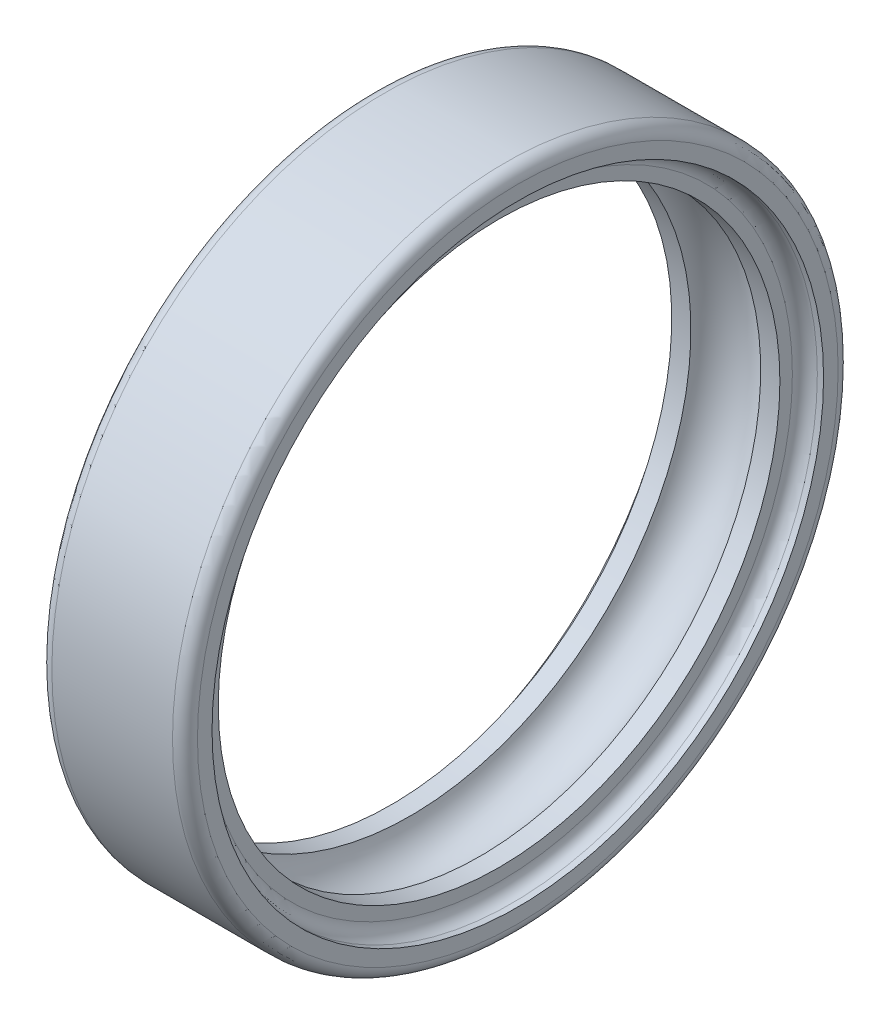
ISO-10303-21;
HEADER;
FILE_DESCRIPTION(('STEP AP214'),'2;1');
FILE_NAME('part.step','',(''),(''),'','','');
FILE_SCHEMA(('AUTOMOTIVE_DESIGN { 1 0 10303 214 1 1 1 1 }'));
ENDSEC;
DATA;
#1=APPLICATION_CONTEXT('core data for automotive mechanical design processes');
#2=APPLICATION_PROTOCOL_DEFINITION('international standard','automotive_design',2000,#1);
#3=PRODUCT_CONTEXT('',#1,'mechanical');
#4=PRODUCT('Part','Part','',(#3));
#5=PRODUCT_RELATED_PRODUCT_CATEGORY('part','',(#4));
#6=PRODUCT_DEFINITION_FORMATION('','',#4);
#7=PRODUCT_DEFINITION_CONTEXT('part definition',#1,'design');
#8=PRODUCT_DEFINITION('design','',#6,#7);
#9=PRODUCT_DEFINITION_SHAPE('','',#8);
#10=(LENGTH_UNIT() NAMED_UNIT(*) SI_UNIT(.MILLI.,.METRE.));
#11=(NAMED_UNIT(*) PLANE_ANGLE_UNIT() SI_UNIT($,.RADIAN.));
#12=(NAMED_UNIT(*) SI_UNIT($,.STERADIAN.) SOLID_ANGLE_UNIT());
#13=UNCERTAINTY_MEASURE_WITH_UNIT(LENGTH_MEASURE(1.E-05),#10,'distance_accuracy_value','');
#14=(GEOMETRIC_REPRESENTATION_CONTEXT(3) GLOBAL_UNCERTAINTY_ASSIGNED_CONTEXT((#13)) GLOBAL_UNIT_ASSIGNED_CONTEXT((#10,
#11,#12)) REPRESENTATION_CONTEXT('',''));
#15=CARTESIAN_POINT('',(0.,0.,0.));
#16=DIRECTION('',(0.,0.,1.));
#17=DIRECTION('',(1.,0.,0.));
#18=AXIS2_PLACEMENT_3D('',#15,#16,#17);
#19=CARTESIAN_POINT('',(0.,-15.6860756936389,-15.4));
#20=DIRECTION('',(-1.,0.,0.));
#21=DIRECTION('',(0.,0.,1.));
#22=AXIS2_PLACEMENT_3D('',#19,#20,#21);
#23=PLANE('',#22);
#24=CARTESIAN_POINT('',(0.,0.,0.));
#25=DIRECTION('',(-1.,0.,0.));
#26=DIRECTION('',(0.,0.,-1.));
#27=AXIS2_PLACEMENT_3D('',#24,#25,#26);
#28=CIRCLE('',#27,15.4000000346272);
#29=CARTESIAN_POINT('',(0.,0.,-15.4000000346272));
#30=VERTEX_POINT('',#29);
#31=EDGE_CURVE('E64',#30,#30,#28,.F.);
#32=ORIENTED_EDGE('',*,*,#31,.F.);
#33=EDGE_LOOP('',(#32));
#34=FACE_BOUND('',#33,.T.);
#35=CARTESIAN_POINT('',(0.,0.,0.));
#36=DIRECTION('',(1.,0.,0.));
#37=DIRECTION('',(0.,-1.16855713314385E-09,1.));
#38=AXIS2_PLACEMENT_3D('',#35,#36,#37);
#39=CIRCLE('',#38,14.7);
#40=CARTESIAN_POINT('',(0.,-1.71777898572145E-08,14.7));
#41=VERTEX_POINT('',#40);
#42=EDGE_CURVE('E61',#41,#41,#39,.T.);
#43=ORIENTED_EDGE('',*,*,#42,.T.);
#44=EDGE_LOOP('',(#43));
#45=FACE_BOUND('',#44,.T.);
#46=ADVANCED_FACE('F17',(#34,#45),#23,.T.);
#47=CARTESIAN_POINT('',(0.9,-14.361926438475,-14.1));
#48=DIRECTION('',(-1.,0.,0.));
#49=DIRECTION('',(0.,0.,1.));
#50=AXIS2_PLACEMENT_3D('',#47,#48,#49);
#51=PLANE('',#50);
#52=CARTESIAN_POINT('',(0.9,0.,0.));
#53=DIRECTION('',(-1.,0.,0.));
#54=DIRECTION('',(0.,0.,-1.));
#55=AXIS2_PLACEMENT_3D('',#52,#53,#54);
#56=CIRCLE('',#55,14.1000000419357);
#57=CARTESIAN_POINT('',(0.9,0.,-14.1000000419357));
#58=VERTEX_POINT('',#57);
#59=EDGE_CURVE('E58',#58,#58,#56,.F.);
#60=ORIENTED_EDGE('',*,*,#59,.F.);
#61=EDGE_LOOP('',(#60));
#62=FACE_BOUND('',#61,.T.);
#63=CARTESIAN_POINT('',(0.9,0.,0.));
#64=DIRECTION('',(1.,0.,0.));
#65=DIRECTION('',(0.,0.,1.));
#66=AXIS2_PLACEMENT_3D('',#63,#64,#65);
#67=CIRCLE('',#66,13.5);
#68=CARTESIAN_POINT('',(0.9,0.,13.5));
#69=VERTEX_POINT('',#68);
#70=EDGE_CURVE('E55',#69,#69,#67,.T.);
#71=ORIENTED_EDGE('',*,*,#70,.T.);
#72=EDGE_LOOP('',(#71));
#73=FACE_BOUND('',#72,.T.);
#74=ADVANCED_FACE('F73',(#62,#73),#51,.T.);
#75=CARTESIAN_POINT('',(6.1,-14.3619264222441,14.1));
#76=DIRECTION('',(1.,0.,0.));
#77=DIRECTION('',(0.,0.,-1.));
#78=AXIS2_PLACEMENT_3D('',#75,#76,#77);
#79=PLANE('',#78);
#80=CARTESIAN_POINT('',(6.1,0.,0.));
#81=DIRECTION('',(1.,0.,0.));
#82=DIRECTION('',(0.,-1.16841660066666E-09,1.));
#83=AXIS2_PLACEMENT_3D('',#80,#81,#82);
#84=CIRCLE('',#83,14.1);
#85=CARTESIAN_POINT('',(6.1,-1.64746740694E-08,14.1));
#86=VERTEX_POINT('',#85);
#87=EDGE_CURVE('E52',#86,#86,#84,.T.);
#88=ORIENTED_EDGE('',*,*,#87,.T.);
#89=EDGE_LOOP('',(#88));
#90=FACE_BOUND('',#89,.T.);
#91=CARTESIAN_POINT('',(6.1,0.,0.));
#92=DIRECTION('',(-1.,0.,0.));
#93=DIRECTION('',(0.,0.,-1.));
#94=AXIS2_PLACEMENT_3D('',#91,#92,#93);
#95=CIRCLE('',#94,13.5);
#96=CARTESIAN_POINT('',(6.1,0.,-13.5));
#97=VERTEX_POINT('',#96);
#98=EDGE_CURVE('E49',#97,#97,#95,.F.);
#99=ORIENTED_EDGE('',*,*,#98,.F.);
#100=EDGE_LOOP('',(#99));
#101=FACE_BOUND('',#100,.T.);
#102=ADVANCED_FACE('F123',(#90,#101),#79,.T.);
#103=CARTESIAN_POINT('',(7.,-15.6860756936389,15.4));
#104=DIRECTION('',(1.,0.,0.));
#105=DIRECTION('',(0.,0.,-1.));
#106=AXIS2_PLACEMENT_3D('',#103,#104,#105);
#107=PLANE('',#106);
#108=CARTESIAN_POINT('',(7.,0.,0.));
#109=DIRECTION('',(1.,0.,0.));
#110=DIRECTION('',(0.,0.,1.));
#111=AXIS2_PLACEMENT_3D('',#108,#109,#110);
#112=CIRCLE('',#111,15.4000000720822);
#113=CARTESIAN_POINT('',(7.,0.,15.4000000720822));
#114=VERTEX_POINT('',#113);
#115=EDGE_CURVE('E46',#114,#114,#112,.T.);
#116=ORIENTED_EDGE('',*,*,#115,.T.);
#117=EDGE_LOOP('',(#116));
#118=FACE_BOUND('',#117,.T.);
#119=CARTESIAN_POINT('',(7.,0.,0.));
#120=DIRECTION('',(-1.,0.,0.));
#121=DIRECTION('',(0.,0.,-1.));
#122=AXIS2_PLACEMENT_3D('',#119,#120,#121);
#123=CIRCLE('',#122,14.7);
#124=CARTESIAN_POINT('',(7.,0.,-14.7));
#125=VERTEX_POINT('',#124);
#126=EDGE_CURVE('E43',#125,#125,#123,.F.);
#127=ORIENTED_EDGE('',*,*,#126,.F.);
#128=EDGE_LOOP('',(#127));
#129=FACE_BOUND('',#128,.T.);
#130=ADVANCED_FACE('F90',(#118,#129),#107,.T.);
#131=CARTESIAN_POINT('',(0.599999999999872,0.,0.));
#132=DIRECTION('',(1.,0.,0.));
#133=DIRECTION('',(0.,1.92328942001804E-10,1.));
#134=AXIS2_PLACEMENT_3D('',#131,#132,#133);
#135=TOROIDAL_SURFACE('',#134,15.4,0.599999999999873);
#136=ORIENTED_EDGE('',*,*,#31,.T.);
#137=EDGE_LOOP('',(#136));
#138=FACE_BOUND('',#137,.T.);
#139=CARTESIAN_POINT('',(0.599999999999872,0.,0.));
#140=DIRECTION('',(-1.,0.,0.));
#141=DIRECTION('',(0.,0.,-1.));
#142=AXIS2_PLACEMENT_3D('',#139,#140,#141);
#143=CIRCLE('',#142,15.9999999999999);
#144=CARTESIAN_POINT('',(0.599999999999872,0.,-15.9999999999999));
#145=VERTEX_POINT('',#144);
#146=EDGE_CURVE('E40',#145,#145,#143,.F.);
#147=ORIENTED_EDGE('',*,*,#146,.F.);
#148=EDGE_LOOP('',(#147));
#149=FACE_BOUND('',#148,.T.);
#150=ADVANCED_FACE('F68',(#138,#149),#135,.T.);
#151=CARTESIAN_POINT('',(50.,0.,0.));
#152=DIRECTION('',(1.,0.,0.));
#153=DIRECTION('',(0.,0.,1.));
#154=AXIS2_PLACEMENT_3D('',#151,#152,#153);
#155=CYLINDRICAL_SURFACE('',#154,14.7);
#156=CARTESIAN_POINT('',(0.299999999999997,0.,0.));
#157=DIRECTION('',(1.,0.,0.));
#158=DIRECTION('',(0.,0.,1.));
#159=AXIS2_PLACEMENT_3D('',#156,#157,#158);
#160=CIRCLE('',#159,14.7);
#161=CARTESIAN_POINT('',(0.299999999999997,0.,14.7));
#162=VERTEX_POINT('',#161);
#163=EDGE_CURVE('E37',#162,#162,#160,.T.);
#164=ORIENTED_EDGE('',*,*,#163,.T.);
#165=EDGE_LOOP('',(#164));
#166=FACE_BOUND('',#165,.T.);
#167=ORIENTED_EDGE('',*,*,#42,.F.);
#168=EDGE_LOOP('',(#167));
#169=FACE_BOUND('',#168,.T.);
#170=ADVANCED_FACE('F77',(#166,#169),#155,.F.);
#171=CARTESIAN_POINT('',(0.300000000000125,0.,0.));
#172=DIRECTION('',(1.,0.,0.));
#173=DIRECTION('',(0.,1.16841659714859E-09,1.));
#174=AXIS2_PLACEMENT_3D('',#171,#172,#173);
#175=TOROIDAL_SURFACE('',#174,14.1000000000001,0.599999999999877);
#176=ORIENTED_EDGE('',*,*,#59,.T.);
#177=EDGE_LOOP('',(#176));
#178=FACE_BOUND('',#177,.T.);
#179=ORIENTED_EDGE('',*,*,#163,.F.);
#180=EDGE_LOOP('',(#179));
#181=FACE_BOUND('',#180,.T.);
#182=ADVANCED_FACE('F79',(#178,#181),#175,.F.);
#183=CARTESIAN_POINT('',(50.,0.,0.));
#184=DIRECTION('',(1.,0.,0.));
#185=DIRECTION('',(0.,0.,1.));
#186=AXIS2_PLACEMENT_3D('',#183,#184,#185);
#187=CYLINDRICAL_SURFACE('',#186,13.5);
#188=CARTESIAN_POINT('',(1.8229490168752,0.,0.));
#189=DIRECTION('',(1.,0.,0.));
#190=DIRECTION('',(0.,0.,1.));
#191=AXIS2_PLACEMENT_3D('',#188,#189,#190);
#192=CIRCLE('',#191,13.5);
#193=CARTESIAN_POINT('',(1.8229490168752,0.,13.5));
#194=VERTEX_POINT('',#193);
#195=EDGE_CURVE('E32',#194,#194,#192,.T.);
#196=ORIENTED_EDGE('',*,*,#195,.T.);
#197=EDGE_LOOP('',(#196));
#198=FACE_BOUND('',#197,.T.);
#199=ORIENTED_EDGE('',*,*,#70,.F.);
#200=EDGE_LOOP('',(#199));
#201=FACE_BOUND('',#200,.T.);
#202=ADVANCED_FACE('F87',(#198,#201),#187,.F.);
#203=CARTESIAN_POINT('',(3.5,0.,0.));
#204=DIRECTION('',(1.,0.,0.));
#205=DIRECTION('',(0.,7.69327835111053E-10,1.));
#206=AXIS2_PLACEMENT_3D('',#203,#204,#205);
#207=TOROIDAL_SURFACE('',#206,13.,1.74999999999994);
#208=ORIENTED_EDGE('',*,*,#195,.F.);
#209=EDGE_LOOP('',(#208));
#210=FACE_BOUND('',#209,.T.);
#211=CARTESIAN_POINT('',(5.17705098312478,0.,0.));
#212=DIRECTION('',(1.,0.,0.));
#213=DIRECTION('',(0.,-1.92332249786123E-10,1.));
#214=AXIS2_PLACEMENT_3D('',#211,#212,#213);
#215=CIRCLE('',#214,13.5);
#216=CARTESIAN_POINT('',(5.17705098312478,-2.59648537211266E-09,13.5));
#217=VERTEX_POINT('',#216);
#218=EDGE_CURVE('E28',#217,#217,#215,.T.);
#219=ORIENTED_EDGE('',*,*,#218,.T.);
#220=EDGE_LOOP('',(#219));
#221=FACE_BOUND('',#220,.T.);
#222=ADVANCED_FACE('F96',(#210,#221),#207,.F.);
#223=CARTESIAN_POINT('',(50.,0.,0.));
#224=DIRECTION('',(1.,0.,0.));
#225=DIRECTION('',(0.,0.,1.));
#226=AXIS2_PLACEMENT_3D('',#223,#224,#225);
#227=CYLINDRICAL_SURFACE('',#226,13.5);
#228=ORIENTED_EDGE('',*,*,#98,.T.);
#229=EDGE_LOOP('',(#228));
#230=FACE_BOUND('',#229,.T.);
#231=ORIENTED_EDGE('',*,*,#218,.F.);
#232=EDGE_LOOP('',(#231));
#233=FACE_BOUND('',#232,.T.);
#234=ADVANCED_FACE('F100',(#230,#233),#227,.F.);
#235=CARTESIAN_POINT('',(6.7,0.,0.));
#236=DIRECTION('',(1.,0.,0.));
#237=DIRECTION('',(0.,0.,1.));
#238=AXIS2_PLACEMENT_3D('',#235,#236,#237);
#239=TOROIDAL_SURFACE('',#238,14.1,0.599999999999927);
#240=ORIENTED_EDGE('',*,*,#87,.F.);
#241=EDGE_LOOP('',(#240));
#242=FACE_BOUND('',#241,.T.);
#243=CARTESIAN_POINT('',(6.7,0.,0.));
#244=DIRECTION('',(1.,0.,0.));
#245=DIRECTION('',(0.,0.,1.));
#246=AXIS2_PLACEMENT_3D('',#243,#244,#245);
#247=CIRCLE('',#246,14.6999999999999);
#248=CARTESIAN_POINT('',(6.7,0.,14.6999999999999));
#249=VERTEX_POINT('',#248);
#250=EDGE_CURVE('E24',#249,#249,#247,.T.);
#251=ORIENTED_EDGE('',*,*,#250,.T.);
#252=EDGE_LOOP('',(#251));
#253=FACE_BOUND('',#252,.T.);
#254=ADVANCED_FACE('F104',(#242,#253),#239,.F.);
#255=CARTESIAN_POINT('',(50.,0.,0.));
#256=DIRECTION('',(1.,0.,0.));
#257=DIRECTION('',(0.,1.16855781751732E-09,1.));
#258=AXIS2_PLACEMENT_3D('',#255,#256,#257);
#259=CYLINDRICAL_SURFACE('',#258,14.7);
#260=ORIENTED_EDGE('',*,*,#126,.T.);
#261=EDGE_LOOP('',(#260));
#262=FACE_BOUND('',#261,.T.);
#263=ORIENTED_EDGE('',*,*,#250,.F.);
#264=EDGE_LOOP('',(#263));
#265=FACE_BOUND('',#264,.T.);
#266=ADVANCED_FACE('F108',(#262,#265),#259,.F.);
#267=CARTESIAN_POINT('',(6.40000000000008,0.,0.));
#268=DIRECTION('',(1.,0.,0.));
#269=DIRECTION('',(0.,0.,1.));
#270=AXIS2_PLACEMENT_3D('',#267,#268,#269);
#271=TOROIDAL_SURFACE('',#270,15.4,0.599999999999924);
#272=CARTESIAN_POINT('',(6.40000000000008,0.,0.));
#273=DIRECTION('',(1.,0.,0.));
#274=DIRECTION('',(0.,0.,1.));
#275=AXIS2_PLACEMENT_3D('',#272,#273,#274);
#276=CIRCLE('',#275,15.9999999999999);
#277=CARTESIAN_POINT('',(6.40000000000008,0.,15.9999999999999));
#278=VERTEX_POINT('',#277);
#279=EDGE_CURVE('E10',#278,#278,#276,.T.);
#280=ORIENTED_EDGE('',*,*,#279,.T.);
#281=EDGE_LOOP('',(#280));
#282=FACE_BOUND('',#281,.T.);
#283=ORIENTED_EDGE('',*,*,#115,.F.);
#284=EDGE_LOOP('',(#283));
#285=FACE_BOUND('',#284,.T.);
#286=ADVANCED_FACE('F111',(#282,#285),#271,.T.);
#287=CARTESIAN_POINT('',(50.,0.,0.));
#288=DIRECTION('',(1.,0.,0.));
#289=DIRECTION('',(0.,1.92328942001804E-10,1.));
#290=AXIS2_PLACEMENT_3D('',#287,#288,#289);
#291=CYLINDRICAL_SURFACE('',#290,16.);
#292=ORIENTED_EDGE('',*,*,#146,.T.);
#293=EDGE_LOOP('',(#292));
#294=FACE_BOUND('',#293,.T.);
#295=ORIENTED_EDGE('',*,*,#279,.F.);
#296=EDGE_LOOP('',(#295));
#297=FACE_BOUND('',#296,.T.);
#298=ADVANCED_FACE('F19',(#294,#297),#291,.T.);
#299=CLOSED_SHELL('',(#46,#74,#102,#130,#150,#170,#182,#202,#222,#234,#254,#266,#286,#298));
#300=MANIFOLD_SOLID_BREP('B1',#299);
#301=ADVANCED_BREP_SHAPE_REPRESENTATION('',(#18,#300),#14);
#302=SHAPE_DEFINITION_REPRESENTATION(#9,#301);
ENDSEC;
END-ISO-10303-21;
